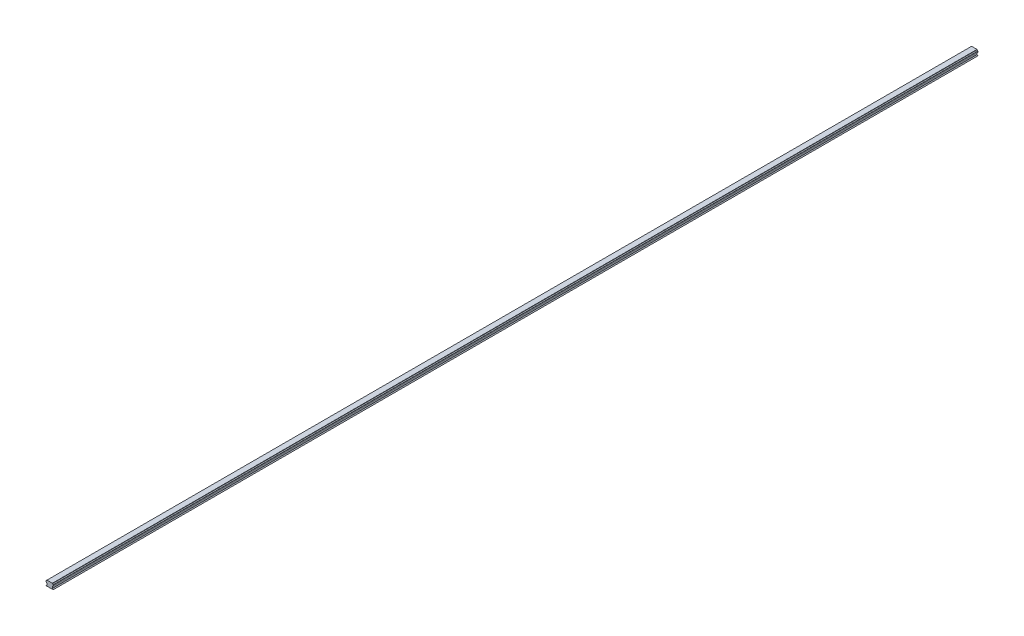
ISO-10303-21;
HEADER;
FILE_DESCRIPTION(('STEP AP214'),'2;1');
FILE_NAME('part.step','',(''),(''),'','','');
FILE_SCHEMA(('AUTOMOTIVE_DESIGN { 1 0 10303 214 1 1 1 1 }'));
ENDSEC;
DATA;
#1=APPLICATION_CONTEXT('core data for automotive mechanical design processes');
#2=APPLICATION_PROTOCOL_DEFINITION('international standard','automotive_design',2000,#1);
#3=PRODUCT_CONTEXT('',#1,'mechanical');
#4=PRODUCT('Part','Part','',(#3));
#5=PRODUCT_RELATED_PRODUCT_CATEGORY('part','',(#4));
#6=PRODUCT_DEFINITION_FORMATION('','',#4);
#7=PRODUCT_DEFINITION_CONTEXT('part definition',#1,'design');
#8=PRODUCT_DEFINITION('design','',#6,#7);
#9=PRODUCT_DEFINITION_SHAPE('','',#8);
#10=(LENGTH_UNIT() NAMED_UNIT(*) SI_UNIT(.MILLI.,.METRE.));
#11=(NAMED_UNIT(*) PLANE_ANGLE_UNIT() SI_UNIT($,.RADIAN.));
#12=(NAMED_UNIT(*) SI_UNIT($,.STERADIAN.) SOLID_ANGLE_UNIT());
#13=UNCERTAINTY_MEASURE_WITH_UNIT(LENGTH_MEASURE(1.E-05),#10,'distance_accuracy_value','');
#14=(GEOMETRIC_REPRESENTATION_CONTEXT(3) GLOBAL_UNCERTAINTY_ASSIGNED_CONTEXT((#13)) GLOBAL_UNIT_ASSIGNED_CONTEXT((#10,
#11,#12)) REPRESENTATION_CONTEXT('',''));
#15=CARTESIAN_POINT('',(0.,0.,0.));
#16=DIRECTION('',(0.,0.,1.));
#17=DIRECTION('',(1.,0.,0.));
#18=AXIS2_PLACEMENT_3D('',#15,#16,#17);
#19=CARTESIAN_POINT('',(12.4987883979856,-8.46322794005069,2900.));
#20=DIRECTION('',(0.,0.,-1.));
#21=DIRECTION('',(-1.,0.,0.));
#22=AXIS2_PLACEMENT_3D('',#19,#20,#21);
#23=CYLINDRICAL_SURFACE('',#22,2.5);
#24=CARTESIAN_POINT('',(12.4987883979856,-8.46322794005069,0.));
#25=DIRECTION('',(0.,0.,1.));
#26=DIRECTION('',(1.,0.,0.));
#27=AXIS2_PLACEMENT_3D('',#24,#25,#26);
#28=CIRCLE('',#27,2.5);
#29=CARTESIAN_POINT('',(12.3041980430387,-5.97081252648865,0.));
#30=VERTEX_POINT('',#29);
#31=CARTESIAN_POINT('',(10.0063729844235,-8.26863758510385,0.));
#32=VERTEX_POINT('',#31);
#33=EDGE_CURVE('E200',#30,#32,#28,.T.);
#34=ORIENTED_EDGE('',*,*,#33,.F.);
#35=DIRECTION('',(0.,0.,-1.));
#36=VECTOR('',#35,1.);
#37=CARTESIAN_POINT('',(12.3041980430387,-5.97081252648865,2900.));
#38=LINE('',#37,#36);
#39=CARTESIAN_POINT('',(12.3041980430387,-5.97081252648865,2900.));
#40=VERTEX_POINT('',#39);
#41=EDGE_CURVE('E11',#40,#30,#38,.T.);
#42=ORIENTED_EDGE('',*,*,#41,.F.);
#43=CARTESIAN_POINT('',(12.4987883979856,-8.46322794005069,2900.));
#44=DIRECTION('',(0.,0.,1.));
#45=DIRECTION('',(1.,0.,0.));
#46=AXIS2_PLACEMENT_3D('',#43,#44,#45);
#47=CIRCLE('',#46,2.5);
#48=CARTESIAN_POINT('',(10.0063729844235,-8.26863758510385,2900.));
#49=VERTEX_POINT('',#48);
#50=EDGE_CURVE('E256',#40,#49,#47,.T.);
#51=ORIENTED_EDGE('',*,*,#50,.T.);
#52=DIRECTION('',(0.,0.,-1.));
#53=VECTOR('',#52,1.);
#54=CARTESIAN_POINT('',(10.0063729844235,-8.26863758510385,2900.));
#55=LINE('',#54,#53);
#56=EDGE_CURVE('E51',#49,#32,#55,.T.);
#57=ORIENTED_EDGE('',*,*,#56,.T.);
#58=EDGE_LOOP('',(#34,#42,#51,#57));
#59=FACE_BOUND('',#58,.T.);
#60=ADVANCED_FACE('F35',(#59),#23,.F.);
#61=CARTESIAN_POINT('',(9.13750528476369,-9.13750528476369,2900.));
#62=DIRECTION('',(0.707106781186548,-0.707106781186548,0.));
#63=DIRECTION('',(0.707106781186548,0.707106781186548,0.));
#64=AXIS2_PLACEMENT_3D('',#61,#62,#63);
#65=PLANE('',#64);
#66=DIRECTION('',(-0.707106781186548,-0.707106781186548,0.));
#67=VECTOR('',#66,1.);
#68=CARTESIAN_POINT('',(9.13750528476369,-9.13750528476369,0.));
#69=LINE('',#68,#67);
#70=CARTESIAN_POINT('',(12.4987883979856,-5.77622217154175,0.));
#71=VERTEX_POINT('',#70);
#72=EDGE_CURVE('E202',#71,#30,#69,.T.);
#73=ORIENTED_EDGE('',*,*,#72,.F.);
#74=DIRECTION('',(0.,0.,-1.));
#75=VECTOR('',#74,1.);
#76=CARTESIAN_POINT('',(12.4987883979856,-5.77622217154175,2900.));
#77=LINE('',#76,#75);
#78=CARTESIAN_POINT('',(12.4987883979856,-5.77622217154175,2900.));
#79=VERTEX_POINT('',#78);
#80=EDGE_CURVE('E43',#79,#71,#77,.T.);
#81=ORIENTED_EDGE('',*,*,#80,.F.);
#82=DIRECTION('',(-0.707106781186548,-0.707106781186548,0.));
#83=VECTOR('',#82,1.);
#84=CARTESIAN_POINT('',(9.13750528476369,-9.13750528476369,2900.));
#85=LINE('',#84,#83);
#86=EDGE_CURVE('E309',#79,#40,#85,.T.);
#87=ORIENTED_EDGE('',*,*,#86,.T.);
#88=ORIENTED_EDGE('',*,*,#41,.T.);
#89=EDGE_LOOP('',(#73,#81,#87,#88));
#90=FACE_BOUND('',#89,.T.);
#91=ADVANCED_FACE('F297',(#90),#65,.T.);
#92=CARTESIAN_POINT('',(12.4987883979856,0.,2900.));
#93=DIRECTION('',(1.,0.,0.));
#94=DIRECTION('',(0.,0.,-1.));
#95=AXIS2_PLACEMENT_3D('',#92,#93,#94);
#96=PLANE('',#95);
#97=DIRECTION('',(0.,-1.,0.));
#98=VECTOR('',#97,1.);
#99=CARTESIAN_POINT('',(12.4987883979856,0.,0.));
#100=LINE('',#99,#98);
#101=CARTESIAN_POINT('',(12.4987883979856,-2.77622217154181,0.));
#102=VERTEX_POINT('',#101);
#103=EDGE_CURVE('E205',#102,#71,#100,.T.);
#104=ORIENTED_EDGE('',*,*,#103,.F.);
#105=DIRECTION('',(0.,0.,-1.));
#106=VECTOR('',#105,1.);
#107=CARTESIAN_POINT('',(12.4987883979856,-2.77622217154181,2900.));
#108=LINE('',#107,#106);
#109=CARTESIAN_POINT('',(12.4987883979856,-2.77622217154181,2900.));
#110=VERTEX_POINT('',#109);
#111=EDGE_CURVE('E286',#110,#102,#108,.T.);
#112=ORIENTED_EDGE('',*,*,#111,.F.);
#113=DIRECTION('',(0.,-1.,0.));
#114=VECTOR('',#113,1.);
#115=CARTESIAN_POINT('',(12.4987883979856,0.,2900.));
#116=LINE('',#115,#114);
#117=EDGE_CURVE('E293',#110,#79,#116,.T.);
#118=ORIENTED_EDGE('',*,*,#117,.T.);
#119=ORIENTED_EDGE('',*,*,#80,.T.);
#120=EDGE_LOOP('',(#104,#112,#118,#119));
#121=FACE_BOUND('',#120,.T.);
#122=ADVANCED_FACE('F291',(#121),#96,.T.);
#123=CARTESIAN_POINT('',(4.86128311322192,4.86128311322192,2900.));
#124=DIRECTION('',(0.707106781186548,0.707106781186548,0.));
#125=DIRECTION('',(-0.707106781186548,0.707106781186548,0.));
#126=AXIS2_PLACEMENT_3D('',#123,#124,#125);
#127=PLANE('',#126);
#128=DIRECTION('',(0.707106781186548,-0.707106781186548,0.));
#129=VECTOR('',#128,1.);
#130=CARTESIAN_POINT('',(4.86128311322192,4.86128311322192,0.));
#131=LINE('',#130,#129);
#132=CARTESIAN_POINT('',(12.3041980430388,-2.58163181659496,0.));
#133=VERTEX_POINT('',#132);
#134=EDGE_CURVE('E208',#133,#102,#131,.T.);
#135=ORIENTED_EDGE('',*,*,#134,.F.);
#136=DIRECTION('',(0.,0.,-1.));
#137=VECTOR('',#136,1.);
#138=CARTESIAN_POINT('',(12.3041980430388,-2.58163181659496,2900.));
#139=LINE('',#138,#137);
#140=CARTESIAN_POINT('',(12.3041980430388,-2.58163181659496,2900.));
#141=VERTEX_POINT('',#140);
#142=EDGE_CURVE('E284',#141,#133,#139,.T.);
#143=ORIENTED_EDGE('',*,*,#142,.F.);
#144=DIRECTION('',(0.707106781186548,-0.707106781186548,0.));
#145=VECTOR('',#144,1.);
#146=CARTESIAN_POINT('',(4.86128311322192,4.86128311322192,2900.));
#147=LINE('',#146,#145);
#148=EDGE_CURVE('E306',#141,#110,#147,.T.);
#149=ORIENTED_EDGE('',*,*,#148,.T.);
#150=ORIENTED_EDGE('',*,*,#111,.T.);
#151=EDGE_LOOP('',(#135,#143,#149,#150));
#152=FACE_BOUND('',#151,.T.);
#153=ADVANCED_FACE('F303',(#152),#127,.T.);
#154=CARTESIAN_POINT('',(12.4987883979856,-0.0892164030329295,2900.));
#155=DIRECTION('',(0.,0.,-1.));
#156=DIRECTION('',(-1.,0.,0.));
#157=AXIS2_PLACEMENT_3D('',#154,#155,#156);
#158=CYLINDRICAL_SURFACE('',#157,2.49999999999998);
#159=CARTESIAN_POINT('',(12.4987883979856,-0.0892164030329295,0.));
#160=DIRECTION('',(0.,0.,1.));
#161=DIRECTION('',(1.,0.,0.));
#162=AXIS2_PLACEMENT_3D('',#159,#160,#161);
#163=CIRCLE('',#162,2.49999999999998);
#164=CARTESIAN_POINT('',(10.0063729844236,-0.283806757979913,0.));
#165=VERTEX_POINT('',#164);
#166=EDGE_CURVE('E211',#165,#133,#163,.T.);
#167=ORIENTED_EDGE('',*,*,#166,.F.);
#168=DIRECTION('',(0.,0.,-1.));
#169=VECTOR('',#168,1.);
#170=CARTESIAN_POINT('',(10.0063729844236,-0.283806757979913,2900.));
#171=LINE('',#170,#169);
#172=CARTESIAN_POINT('',(10.0063729844236,-0.283806757979913,2900.));
#173=VERTEX_POINT('',#172);
#174=EDGE_CURVE('E282',#173,#165,#171,.T.);
#175=ORIENTED_EDGE('',*,*,#174,.F.);
#176=CARTESIAN_POINT('',(12.4987883979856,-0.0892164030329295,2900.));
#177=DIRECTION('',(0.,0.,1.));
#178=DIRECTION('',(1.,0.,0.));
#179=AXIS2_PLACEMENT_3D('',#176,#177,#178);
#180=CIRCLE('',#179,2.49999999999998);
#181=EDGE_CURVE('E311',#173,#141,#180,.T.);
#182=ORIENTED_EDGE('',*,*,#181,.T.);
#183=ORIENTED_EDGE('',*,*,#142,.T.);
#184=EDGE_LOOP('',(#167,#175,#182,#183));
#185=FACE_BOUND('',#184,.T.);
#186=ADVANCED_FACE('F515',(#185),#158,.F.);
#187=CARTESIAN_POINT('',(4.86128311322186,4.86128311322186,2900.));
#188=DIRECTION('',(0.707106781186548,0.707106781186548,0.));
#189=DIRECTION('',(-0.707106781186548,0.707106781186548,0.));
#190=AXIS2_PLACEMENT_3D('',#187,#188,#189);
#191=PLANE('',#190);
#192=DIRECTION('',(0.707106781186548,-0.707106781186548,0.));
#193=VECTOR('',#192,1.);
#194=CARTESIAN_POINT('',(4.86128311322186,4.86128311322186,0.));
#195=LINE('',#194,#193);
#196=CARTESIAN_POINT('',(9.49878839798586,0.223777828457852,0.));
#197=VERTEX_POINT('',#196);
#198=EDGE_CURVE('E214',#197,#165,#195,.T.);
#199=ORIENTED_EDGE('',*,*,#198,.F.);
#200=DIRECTION('',(0.,0.,-1.));
#201=VECTOR('',#200,1.);
#202=CARTESIAN_POINT('',(9.49878839798586,0.223777828457852,2900.));
#203=LINE('',#202,#201);
#204=CARTESIAN_POINT('',(9.49878839798586,0.223777828457852,2900.));
#205=VERTEX_POINT('',#204);
#206=EDGE_CURVE('E280',#205,#197,#203,.T.);
#207=ORIENTED_EDGE('',*,*,#206,.F.);
#208=DIRECTION('',(0.707106781186548,-0.707106781186548,0.));
#209=VECTOR('',#208,1.);
#210=CARTESIAN_POINT('',(4.86128311322186,4.86128311322186,2900.));
#211=LINE('',#210,#209);
#212=EDGE_CURVE('E317',#205,#173,#211,.T.);
#213=ORIENTED_EDGE('',*,*,#212,.T.);
#214=ORIENTED_EDGE('',*,*,#174,.T.);
#215=EDGE_LOOP('',(#199,#207,#213,#214));
#216=FACE_BOUND('',#215,.T.);
#217=ADVANCED_FACE('F505',(#216),#191,.T.);
#218=CARTESIAN_POINT('',(0.,0.223777828457852,2900.));
#219=DIRECTION('',(0.,1.,0.));
#220=DIRECTION('',(0.,0.,1.));
#221=AXIS2_PLACEMENT_3D('',#218,#219,#220);
#222=PLANE('',#221);
#223=DIRECTION('',(1.,0.,0.));
#224=VECTOR('',#223,1.);
#225=CARTESIAN_POINT('',(0.,0.223777828457852,0.));
#226=LINE('',#225,#224);
#227=CARTESIAN_POINT('',(-7.50121160201477,0.223777828457853,0.));
#228=VERTEX_POINT('',#227);
#229=EDGE_CURVE('E217',#228,#197,#226,.T.);
#230=ORIENTED_EDGE('',*,*,#229,.F.);
#231=DIRECTION('',(0.,0.,-1.));
#232=VECTOR('',#231,1.);
#233=CARTESIAN_POINT('',(-7.50121160201477,0.223777828457853,2900.));
#234=LINE('',#233,#232);
#235=CARTESIAN_POINT('',(-7.50121160201477,0.223777828457853,2900.));
#236=VERTEX_POINT('',#235);
#237=EDGE_CURVE('E278',#236,#228,#234,.T.);
#238=ORIENTED_EDGE('',*,*,#237,.F.);
#239=DIRECTION('',(1.,0.,0.));
#240=VECTOR('',#239,1.);
#241=CARTESIAN_POINT('',(0.,0.223777828457852,2900.));
#242=LINE('',#241,#240);
#243=EDGE_CURVE('E320',#236,#205,#242,.T.);
#244=ORIENTED_EDGE('',*,*,#243,.T.);
#245=ORIENTED_EDGE('',*,*,#206,.T.);
#246=EDGE_LOOP('',(#230,#238,#244,#245));
#247=FACE_BOUND('',#246,.T.);
#248=ADVANCED_FACE('F495',(#247),#222,.T.);
#249=CARTESIAN_POINT('',(-3.86249471523632,3.86249471523631,2900.));
#250=DIRECTION('',(-0.707106781186549,0.707106781186546,0.));
#251=DIRECTION('',(-0.707106781186546,-0.707106781186549,0.));
#252=AXIS2_PLACEMENT_3D('',#249,#250,#251);
#253=PLANE('',#252);
#254=DIRECTION('',(0.707106781186546,0.707106781186549,0.));
#255=VECTOR('',#254,1.);
#256=CARTESIAN_POINT('',(-3.86249471523632,3.86249471523631,0.));
#257=LINE('',#256,#255);
#258=CARTESIAN_POINT('',(-8.0087961884529,-0.283806757980286,0.));
#259=VERTEX_POINT('',#258);
#260=EDGE_CURVE('E220',#259,#228,#257,.T.);
#261=ORIENTED_EDGE('',*,*,#260,.F.);
#262=DIRECTION('',(0.,0.,-1.));
#263=VECTOR('',#262,1.);
#264=CARTESIAN_POINT('',(-8.0087961884529,-0.283806757980286,2900.));
#265=LINE('',#264,#263);
#266=CARTESIAN_POINT('',(-8.0087961884529,-0.283806757980286,2900.));
#267=VERTEX_POINT('',#266);
#268=EDGE_CURVE('E276',#267,#259,#265,.T.);
#269=ORIENTED_EDGE('',*,*,#268,.F.);
#270=DIRECTION('',(0.707106781186546,0.707106781186549,0.));
#271=VECTOR('',#270,1.);
#272=CARTESIAN_POINT('',(-3.86249471523632,3.86249471523631,2900.));
#273=LINE('',#272,#271);
#274=EDGE_CURVE('E323',#267,#236,#273,.T.);
#275=ORIENTED_EDGE('',*,*,#274,.T.);
#276=ORIENTED_EDGE('',*,*,#237,.T.);
#277=EDGE_LOOP('',(#261,#269,#275,#276));
#278=FACE_BOUND('',#277,.T.);
#279=ADVANCED_FACE('F485',(#278),#253,.T.);
#280=CARTESIAN_POINT('',(-10.5012116020148,-0.0892164030332557,2900.));
#281=DIRECTION('',(0.,0.,-1.));
#282=DIRECTION('',(-1.,0.,0.));
#283=AXIS2_PLACEMENT_3D('',#280,#281,#282);
#284=CYLINDRICAL_SURFACE('',#283,2.49999999999983);
#285=CARTESIAN_POINT('',(-10.5012116020148,-0.0892164030332557,0.));
#286=DIRECTION('',(0.,0.,1.));
#287=DIRECTION('',(1.,0.,0.));
#288=AXIS2_PLACEMENT_3D('',#285,#286,#287);
#289=CIRCLE('',#288,2.49999999999983);
#290=CARTESIAN_POINT('',(-10.3066212470681,-2.58163181659515,0.));
#291=VERTEX_POINT('',#290);
#292=EDGE_CURVE('E223',#291,#259,#289,.T.);
#293=ORIENTED_EDGE('',*,*,#292,.F.);
#294=DIRECTION('',(0.,0.,-1.));
#295=VECTOR('',#294,1.);
#296=CARTESIAN_POINT('',(-10.3066212470681,-2.58163181659515,2900.));
#297=LINE('',#296,#295);
#298=CARTESIAN_POINT('',(-10.3066212470681,-2.58163181659515,2900.));
#299=VERTEX_POINT('',#298);
#300=EDGE_CURVE('E274',#299,#291,#297,.T.);
#301=ORIENTED_EDGE('',*,*,#300,.F.);
#302=CARTESIAN_POINT('',(-10.5012116020148,-0.0892164030332557,2900.));
#303=DIRECTION('',(0.,0.,1.));
#304=DIRECTION('',(1.,0.,0.));
#305=AXIS2_PLACEMENT_3D('',#302,#303,#304);
#306=CIRCLE('',#305,2.49999999999983);
#307=EDGE_CURVE('E326',#299,#267,#306,.T.);
#308=ORIENTED_EDGE('',*,*,#307,.T.);
#309=ORIENTED_EDGE('',*,*,#268,.T.);
#310=EDGE_LOOP('',(#293,#301,#308,#309));
#311=FACE_BOUND('',#310,.T.);
#312=ADVANCED_FACE('F475',(#311),#284,.F.);
#313=CARTESIAN_POINT('',(-3.86249471523647,3.86249471523647,2900.));
#314=DIRECTION('',(-0.707106781186548,0.707106781186548,0.));
#315=DIRECTION('',(-0.707106781186548,-0.707106781186548,0.));
#316=AXIS2_PLACEMENT_3D('',#313,#314,#315);
#317=PLANE('',#316);
#318=DIRECTION('',(0.707106781186548,0.707106781186548,0.));
#319=VECTOR('',#318,1.);
#320=CARTESIAN_POINT('',(-3.86249471523647,3.86249471523647,0.));
#321=LINE('',#320,#319);
#322=CARTESIAN_POINT('',(-10.5012116020148,-2.77622217154183,0.));
#323=VERTEX_POINT('',#322);
#324=EDGE_CURVE('E226',#323,#291,#321,.T.);
#325=ORIENTED_EDGE('',*,*,#324,.F.);
#326=DIRECTION('',(0.,0.,-1.));
#327=VECTOR('',#326,1.);
#328=CARTESIAN_POINT('',(-10.5012116020148,-2.77622217154183,2900.));
#329=LINE('',#328,#327);
#330=CARTESIAN_POINT('',(-10.5012116020148,-2.77622217154183,2900.));
#331=VERTEX_POINT('',#330);
#332=EDGE_CURVE('E272',#331,#323,#329,.T.);
#333=ORIENTED_EDGE('',*,*,#332,.F.);
#334=DIRECTION('',(0.707106781186548,0.707106781186548,0.));
#335=VECTOR('',#334,1.);
#336=CARTESIAN_POINT('',(-3.86249471523647,3.86249471523647,2900.));
#337=LINE('',#336,#335);
#338=EDGE_CURVE('E329',#331,#299,#337,.T.);
#339=ORIENTED_EDGE('',*,*,#338,.T.);
#340=ORIENTED_EDGE('',*,*,#300,.T.);
#341=EDGE_LOOP('',(#325,#333,#339,#340));
#342=FACE_BOUND('',#341,.T.);
#343=ADVANCED_FACE('F465',(#342),#317,.T.);
#344=CARTESIAN_POINT('',(-10.5012116020148,0.,2900.));
#345=DIRECTION('',(-1.,0.,0.));
#346=DIRECTION('',(0.,0.,1.));
#347=AXIS2_PLACEMENT_3D('',#344,#345,#346);
#348=PLANE('',#347);
#349=DIRECTION('',(0.,1.,0.));
#350=VECTOR('',#349,1.);
#351=CARTESIAN_POINT('',(-10.5012116020148,0.,0.));
#352=LINE('',#351,#350);
#353=CARTESIAN_POINT('',(-10.5012116020148,-5.77622217154183,0.));
#354=VERTEX_POINT('',#353);
#355=EDGE_CURVE('E229',#354,#323,#352,.T.);
#356=ORIENTED_EDGE('',*,*,#355,.F.);
#357=DIRECTION('',(0.,0.,-1.));
#358=VECTOR('',#357,1.);
#359=CARTESIAN_POINT('',(-10.5012116020148,-5.77622217154183,2900.));
#360=LINE('',#359,#358);
#361=CARTESIAN_POINT('',(-10.5012116020148,-5.77622217154183,2900.));
#362=VERTEX_POINT('',#361);
#363=EDGE_CURVE('E270',#362,#354,#360,.T.);
#364=ORIENTED_EDGE('',*,*,#363,.F.);
#365=DIRECTION('',(0.,1.,0.));
#366=VECTOR('',#365,1.);
#367=CARTESIAN_POINT('',(-10.5012116020148,0.,2900.));
#368=LINE('',#367,#366);
#369=EDGE_CURVE('E332',#362,#331,#368,.T.);
#370=ORIENTED_EDGE('',*,*,#369,.T.);
#371=ORIENTED_EDGE('',*,*,#332,.T.);
#372=EDGE_LOOP('',(#356,#364,#370,#371));
#373=FACE_BOUND('',#372,.T.);
#374=ADVANCED_FACE('F455',(#373),#348,.T.);
#375=CARTESIAN_POINT('',(-8.1387168867783,-8.1387168867783,2900.));
#376=DIRECTION('',(-0.707106781186548,-0.707106781186548,0.));
#377=DIRECTION('',(0.707106781186548,-0.707106781186548,0.));
#378=AXIS2_PLACEMENT_3D('',#375,#376,#377);
#379=PLANE('',#378);
#380=DIRECTION('',(-0.707106781186548,0.707106781186548,0.));
#381=VECTOR('',#380,1.);
#382=CARTESIAN_POINT('',(-8.1387168867783,-8.1387168867783,0.));
#383=LINE('',#382,#381);
#384=CARTESIAN_POINT('',(-10.3066212470679,-5.97081252648868,0.));
#385=VERTEX_POINT('',#384);
#386=EDGE_CURVE('E232',#385,#354,#383,.T.);
#387=ORIENTED_EDGE('',*,*,#386,.F.);
#388=DIRECTION('',(0.,0.,-1.));
#389=VECTOR('',#388,1.);
#390=CARTESIAN_POINT('',(-10.3066212470679,-5.97081252648868,2900.));
#391=LINE('',#390,#389);
#392=CARTESIAN_POINT('',(-10.3066212470679,-5.97081252648868,2900.));
#393=VERTEX_POINT('',#392);
#394=EDGE_CURVE('E268',#393,#385,#391,.T.);
#395=ORIENTED_EDGE('',*,*,#394,.F.);
#396=DIRECTION('',(-0.707106781186548,0.707106781186548,0.));
#397=VECTOR('',#396,1.);
#398=CARTESIAN_POINT('',(-8.1387168867783,-8.1387168867783,2900.));
#399=LINE('',#398,#397);
#400=EDGE_CURVE('E335',#393,#362,#399,.T.);
#401=ORIENTED_EDGE('',*,*,#400,.T.);
#402=ORIENTED_EDGE('',*,*,#363,.T.);
#403=EDGE_LOOP('',(#387,#395,#401,#402));
#404=FACE_BOUND('',#403,.T.);
#405=ADVANCED_FACE('F445',(#404),#379,.T.);
#406=CARTESIAN_POINT('',(-10.5012116020148,-8.46322794005072,2900.));
#407=DIRECTION('',(0.,0.,-1.));
#408=DIRECTION('',(-1.,0.,0.));
#409=AXIS2_PLACEMENT_3D('',#406,#407,#408);
#410=CYLINDRICAL_SURFACE('',#409,2.5);
#411=CARTESIAN_POINT('',(-10.5012116020148,-8.46322794005072,0.));
#412=DIRECTION('',(0.,0.,1.));
#413=DIRECTION('',(1.,0.,0.));
#414=AXIS2_PLACEMENT_3D('',#411,#412,#413);
#415=CIRCLE('',#414,2.5);
#416=CARTESIAN_POINT('',(-8.00879618845272,-8.26863758510388,0.));
#417=VERTEX_POINT('',#416);
#418=EDGE_CURVE('E235',#417,#385,#415,.T.);
#419=ORIENTED_EDGE('',*,*,#418,.F.);
#420=DIRECTION('',(0.,0.,-1.));
#421=VECTOR('',#420,1.);
#422=CARTESIAN_POINT('',(-8.00879618845272,-8.26863758510388,2900.));
#423=LINE('',#422,#421);
#424=CARTESIAN_POINT('',(-8.00879618845272,-8.26863758510388,2900.));
#425=VERTEX_POINT('',#424);
#426=EDGE_CURVE('E266',#425,#417,#423,.T.);
#427=ORIENTED_EDGE('',*,*,#426,.F.);
#428=CARTESIAN_POINT('',(-10.5012116020148,-8.46322794005072,2900.));
#429=DIRECTION('',(0.,0.,1.));
#430=DIRECTION('',(1.,0.,0.));
#431=AXIS2_PLACEMENT_3D('',#428,#429,#430);
#432=CIRCLE('',#431,2.5);
#433=EDGE_CURVE('E338',#425,#393,#432,.T.);
#434=ORIENTED_EDGE('',*,*,#433,.T.);
#435=ORIENTED_EDGE('',*,*,#394,.T.);
#436=EDGE_LOOP('',(#419,#427,#434,#435));
#437=FACE_BOUND('',#436,.T.);
#438=ADVANCED_FACE('F435',(#437),#410,.F.);
#439=CARTESIAN_POINT('',(-8.1387168867783,-8.1387168867783,2900.));
#440=DIRECTION('',(-0.707106781186548,-0.707106781186548,0.));
#441=DIRECTION('',(0.707106781186548,-0.707106781186548,0.));
#442=AXIS2_PLACEMENT_3D('',#439,#440,#441);
#443=PLANE('',#442);
#444=DIRECTION('',(-0.707106781186548,0.707106781186548,0.));
#445=VECTOR('',#444,1.);
#446=CARTESIAN_POINT('',(-8.1387168867783,-8.1387168867783,0.));
#447=LINE('',#446,#445);
#448=CARTESIAN_POINT('',(-7.50121160201465,-8.77622217154195,0.));
#449=VERTEX_POINT('',#448);
#450=EDGE_CURVE('E238',#449,#417,#447,.T.);
#451=ORIENTED_EDGE('',*,*,#450,.F.);
#452=DIRECTION('',(0.,0.,-1.));
#453=VECTOR('',#452,1.);
#454=CARTESIAN_POINT('',(-7.50121160201465,-8.77622217154195,2900.));
#455=LINE('',#454,#453);
#456=CARTESIAN_POINT('',(-7.50121160201465,-8.77622217154195,2900.));
#457=VERTEX_POINT('',#456);
#458=EDGE_CURVE('E264',#457,#449,#455,.T.);
#459=ORIENTED_EDGE('',*,*,#458,.F.);
#460=DIRECTION('',(-0.707106781186548,0.707106781186548,0.));
#461=VECTOR('',#460,1.);
#462=CARTESIAN_POINT('',(-8.1387168867783,-8.1387168867783,2900.));
#463=LINE('',#462,#461);
#464=EDGE_CURVE('E341',#457,#425,#463,.T.);
#465=ORIENTED_EDGE('',*,*,#464,.T.);
#466=ORIENTED_EDGE('',*,*,#426,.T.);
#467=EDGE_LOOP('',(#451,#459,#465,#466));
#468=FACE_BOUND('',#467,.T.);
#469=ADVANCED_FACE('F426',(#468),#443,.T.);
#470=CARTESIAN_POINT('',(-7.50121160201465,0.,2900.));
#471=DIRECTION('',(-1.,0.,0.));
#472=DIRECTION('',(0.,0.,1.));
#473=AXIS2_PLACEMENT_3D('',#470,#471,#472);
#474=PLANE('',#473);
#475=DIRECTION('',(0.,1.,0.));
#476=VECTOR('',#475,1.);
#477=CARTESIAN_POINT('',(-7.50121160201465,0.,0.));
#478=LINE('',#477,#476);
#479=CARTESIAN_POINT('',(-7.50121160201465,-13.7762221715419,0.));
#480=VERTEX_POINT('',#479);
#481=EDGE_CURVE('E241',#480,#449,#478,.T.);
#482=ORIENTED_EDGE('',*,*,#481,.F.);
#483=DIRECTION('',(0.,0.,-1.));
#484=VECTOR('',#483,1.);
#485=CARTESIAN_POINT('',(-7.50121160201465,-13.7762221715419,2900.));
#486=LINE('',#485,#484);
#487=CARTESIAN_POINT('',(-7.50121160201465,-13.7762221715419,2900.));
#488=VERTEX_POINT('',#487);
#489=EDGE_CURVE('E262',#488,#480,#486,.T.);
#490=ORIENTED_EDGE('',*,*,#489,.F.);
#491=DIRECTION('',(0.,1.,0.));
#492=VECTOR('',#491,1.);
#493=CARTESIAN_POINT('',(-7.50121160201465,0.,2900.));
#494=LINE('',#493,#492);
#495=EDGE_CURVE('E344',#488,#457,#494,.T.);
#496=ORIENTED_EDGE('',*,*,#495,.T.);
#497=ORIENTED_EDGE('',*,*,#458,.T.);
#498=EDGE_LOOP('',(#482,#490,#496,#497));
#499=FACE_BOUND('',#498,.T.);
#500=ADVANCED_FACE('F357',(#499),#474,.T.);
#501=CARTESIAN_POINT('',(3.13750528476362,-3.13750528476363,2900.));
#502=DIRECTION('',(-0.707106781186547,0.707106781186548,0.));
#503=DIRECTION('',(-0.707106781186548,-0.707106781186547,0.));
#504=AXIS2_PLACEMENT_3D('',#501,#502,#503);
#505=PLANE('',#504);
#506=DIRECTION('',(0.707106781186548,0.707106781186547,0.));
#507=VECTOR('',#506,1.);
#508=CARTESIAN_POINT('',(3.13750528476362,-3.13750528476363,0.));
#509=LINE('',#508,#507);
#510=CARTESIAN_POINT('',(-10.0012116020146,-16.2762221715419,0.));
#511=VERTEX_POINT('',#510);
#512=EDGE_CURVE('E244',#511,#480,#509,.T.);
#513=ORIENTED_EDGE('',*,*,#512,.F.);
#514=DIRECTION('',(0.,0.,-1.));
#515=VECTOR('',#514,1.);
#516=CARTESIAN_POINT('',(-10.0012116020146,-16.2762221715419,2900.));
#517=LINE('',#516,#515);
#518=CARTESIAN_POINT('',(-10.0012116020146,-16.2762221715419,2900.));
#519=VERTEX_POINT('',#518);
#520=EDGE_CURVE('E260',#519,#511,#517,.T.);
#521=ORIENTED_EDGE('',*,*,#520,.F.);
#522=DIRECTION('',(0.707106781186548,0.707106781186547,0.));
#523=VECTOR('',#522,1.);
#524=CARTESIAN_POINT('',(3.13750528476362,-3.13750528476363,2900.));
#525=LINE('',#524,#523);
#526=EDGE_CURVE('E347',#519,#488,#525,.T.);
#527=ORIENTED_EDGE('',*,*,#526,.T.);
#528=ORIENTED_EDGE('',*,*,#489,.T.);
#529=EDGE_LOOP('',(#513,#521,#527,#528));
#530=FACE_BOUND('',#529,.T.);
#531=ADVANCED_FACE('F351',(#530),#505,.T.);
#532=CARTESIAN_POINT('',(0.,-16.2762221715418,2900.));
#533=DIRECTION('',(0.,1.,0.));
#534=DIRECTION('',(-1.,0.,0.));
#535=AXIS2_PLACEMENT_3D('',#532,#533,#534);
#536=PLANE('',#535);
#537=DIRECTION('',(1.,0.,0.));
#538=VECTOR('',#537,1.);
#539=CARTESIAN_POINT('',(0.,-16.2762221715418,0.));
#540=LINE('',#539,#538);
#541=CARTESIAN_POINT('',(11.9987883979856,-16.2762221715418,0.));
#542=VERTEX_POINT('',#541);
#543=EDGE_CURVE('E247',#511,#542,#540,.T.);
#544=ORIENTED_EDGE('',*,*,#543,.T.);
#545=DIRECTION('',(0.,0.,-1.));
#546=VECTOR('',#545,1.);
#547=CARTESIAN_POINT('',(11.9987883979856,-16.2762221715418,2900.));
#548=LINE('',#547,#546);
#549=CARTESIAN_POINT('',(11.9987883979856,-16.2762221715418,2900.));
#550=VERTEX_POINT('',#549);
#551=EDGE_CURVE('E182',#550,#542,#548,.T.);
#552=ORIENTED_EDGE('',*,*,#551,.F.);
#553=DIRECTION('',(1.,0.,0.));
#554=VECTOR('',#553,1.);
#555=CARTESIAN_POINT('',(0.,-16.2762221715418,2900.));
#556=LINE('',#555,#554);
#557=EDGE_CURVE('E191',#519,#550,#556,.T.);
#558=ORIENTED_EDGE('',*,*,#557,.F.);
#559=ORIENTED_EDGE('',*,*,#520,.T.);
#560=EDGE_LOOP('',(#544,#552,#558,#559));
#561=FACE_BOUND('',#560,.T.);
#562=ADVANCED_FACE('F361',(#561),#536,.F.);
#563=CARTESIAN_POINT('',(-2.13871688677806,-2.13871688677806,2900.));
#564=DIRECTION('',(0.707106781186548,0.707106781186548,0.));
#565=DIRECTION('',(-0.707106781186548,0.707106781186548,0.));
#566=AXIS2_PLACEMENT_3D('',#563,#564,#565);
#567=PLANE('',#566);
#568=DIRECTION('',(0.707106781186548,-0.707106781186548,0.));
#569=VECTOR('',#568,1.);
#570=CARTESIAN_POINT('',(-2.13871688677806,-2.13871688677806,0.));
#571=LINE('',#570,#569);
#572=CARTESIAN_POINT('',(9.49878839798558,-13.7762221715417,0.));
#573=VERTEX_POINT('',#572);
#574=EDGE_CURVE('E178',#573,#542,#571,.T.);
#575=ORIENTED_EDGE('',*,*,#574,.F.);
#576=DIRECTION('',(0.,0.,-1.));
#577=VECTOR('',#576,1.);
#578=CARTESIAN_POINT('',(9.49878839798558,-13.7762221715417,2900.));
#579=LINE('',#578,#577);
#580=CARTESIAN_POINT('',(9.49878839798558,-13.7762221715417,2900.));
#581=VERTEX_POINT('',#580);
#582=EDGE_CURVE('E173',#581,#573,#579,.T.);
#583=ORIENTED_EDGE('',*,*,#582,.F.);
#584=DIRECTION('',(0.707106781186548,-0.707106781186548,0.));
#585=VECTOR('',#584,1.);
#586=CARTESIAN_POINT('',(-2.13871688677806,-2.13871688677806,2900.));
#587=LINE('',#586,#585);
#588=EDGE_CURVE('E176',#581,#550,#587,.T.);
#589=ORIENTED_EDGE('',*,*,#588,.T.);
#590=ORIENTED_EDGE('',*,*,#551,.T.);
#591=EDGE_LOOP('',(#575,#583,#589,#590));
#592=FACE_BOUND('',#591,.T.);
#593=ADVANCED_FACE('F175',(#592),#567,.T.);
#594=CARTESIAN_POINT('',(9.49878839798558,0.,2900.));
#595=DIRECTION('',(1.,0.,0.));
#596=DIRECTION('',(0.,0.,-1.));
#597=AXIS2_PLACEMENT_3D('',#594,#595,#596);
#598=PLANE('',#597);
#599=DIRECTION('',(0.,-1.,0.));
#600=VECTOR('',#599,1.);
#601=CARTESIAN_POINT('',(9.49878839798558,0.,0.));
#602=LINE('',#601,#600);
#603=CARTESIAN_POINT('',(9.49878839798558,-8.77622217154181,0.));
#604=VERTEX_POINT('',#603);
#605=EDGE_CURVE('E251',#604,#573,#602,.T.);
#606=ORIENTED_EDGE('',*,*,#605,.F.);
#607=DIRECTION('',(0.,0.,-1.));
#608=VECTOR('',#607,1.);
#609=CARTESIAN_POINT('',(9.49878839798558,-8.77622217154181,2900.));
#610=LINE('',#609,#608);
#611=CARTESIAN_POINT('',(9.49878839798558,-8.77622217154181,2900.));
#612=VERTEX_POINT('',#611);
#613=EDGE_CURVE('E112',#612,#604,#610,.T.);
#614=ORIENTED_EDGE('',*,*,#613,.F.);
#615=DIRECTION('',(0.,-1.,0.));
#616=VECTOR('',#615,1.);
#617=CARTESIAN_POINT('',(9.49878839798558,0.,2900.));
#618=LINE('',#617,#616);
#619=EDGE_CURVE('E188',#612,#581,#618,.T.);
#620=ORIENTED_EDGE('',*,*,#619,.T.);
#621=ORIENTED_EDGE('',*,*,#582,.T.);
#622=EDGE_LOOP('',(#606,#614,#620,#621));
#623=FACE_BOUND('',#622,.T.);
#624=ADVANCED_FACE('F194',(#623),#598,.T.);
#625=CARTESIAN_POINT('',(9.13750528476369,-9.13750528476369,2900.));
#626=DIRECTION('',(0.707106781186548,-0.707106781186548,0.));
#627=DIRECTION('',(0.707106781186548,0.707106781186548,0.));
#628=AXIS2_PLACEMENT_3D('',#625,#626,#627);
#629=PLANE('',#628);
#630=DIRECTION('',(-0.707106781186548,-0.707106781186548,0.));
#631=VECTOR('',#630,1.);
#632=CARTESIAN_POINT('',(9.13750528476369,-9.13750528476369,0.));
#633=LINE('',#632,#631);
#634=EDGE_CURVE('E253',#32,#604,#633,.T.);
#635=ORIENTED_EDGE('',*,*,#634,.F.);
#636=ORIENTED_EDGE('',*,*,#56,.F.);
#637=DIRECTION('',(-0.707106781186548,-0.707106781186548,0.));
#638=VECTOR('',#637,1.);
#639=CARTESIAN_POINT('',(9.13750528476369,-9.13750528476369,2900.));
#640=LINE('',#639,#638);
#641=EDGE_CURVE('E195',#49,#612,#640,.T.);
#642=ORIENTED_EDGE('',*,*,#641,.T.);
#643=ORIENTED_EDGE('',*,*,#613,.T.);
#644=EDGE_LOOP('',(#635,#636,#642,#643));
#645=FACE_BOUND('',#644,.T.);
#646=ADVANCED_FACE('F374',(#645),#629,.T.);
#647=CARTESIAN_POINT('',(0.,0.,2900.));
#648=DIRECTION('',(0.,0.,1.));
#649=DIRECTION('',(1.,0.,0.));
#650=AXIS2_PLACEMENT_3D('',#647,#648,#649);
#651=PLANE('',#650);
#652=ORIENTED_EDGE('',*,*,#50,.F.);
#653=ORIENTED_EDGE('',*,*,#86,.F.);
#654=ORIENTED_EDGE('',*,*,#117,.F.);
#655=ORIENTED_EDGE('',*,*,#148,.F.);
#656=ORIENTED_EDGE('',*,*,#181,.F.);
#657=ORIENTED_EDGE('',*,*,#212,.F.);
#658=ORIENTED_EDGE('',*,*,#243,.F.);
#659=ORIENTED_EDGE('',*,*,#274,.F.);
#660=ORIENTED_EDGE('',*,*,#307,.F.);
#661=ORIENTED_EDGE('',*,*,#338,.F.);
#662=ORIENTED_EDGE('',*,*,#369,.F.);
#663=ORIENTED_EDGE('',*,*,#400,.F.);
#664=ORIENTED_EDGE('',*,*,#433,.F.);
#665=ORIENTED_EDGE('',*,*,#464,.F.);
#666=ORIENTED_EDGE('',*,*,#495,.F.);
#667=ORIENTED_EDGE('',*,*,#526,.F.);
#668=ORIENTED_EDGE('',*,*,#557,.T.);
#669=ORIENTED_EDGE('',*,*,#588,.F.);
#670=ORIENTED_EDGE('',*,*,#619,.F.);
#671=ORIENTED_EDGE('',*,*,#641,.F.);
#672=EDGE_LOOP('',(#652,#653,#654,#655,#656,#657,#658,#659,#660,#661,#662,#663,#664,#665,#666,
#667,#668,#669,#670,#671));
#673=FACE_BOUND('',#672,.T.);
#674=ADVANCED_FACE('F186',(#673),#651,.T.);
#675=CARTESIAN_POINT('',(0.,0.,0.));
#676=DIRECTION('',(0.,0.,1.));
#677=DIRECTION('',(1.,0.,0.));
#678=AXIS2_PLACEMENT_3D('',#675,#676,#677);
#679=PLANE('',#678);
#680=ORIENTED_EDGE('',*,*,#33,.T.);
#681=ORIENTED_EDGE('',*,*,#634,.T.);
#682=ORIENTED_EDGE('',*,*,#605,.T.);
#683=ORIENTED_EDGE('',*,*,#574,.T.);
#684=ORIENTED_EDGE('',*,*,#543,.F.);
#685=ORIENTED_EDGE('',*,*,#512,.T.);
#686=ORIENTED_EDGE('',*,*,#481,.T.);
#687=ORIENTED_EDGE('',*,*,#450,.T.);
#688=ORIENTED_EDGE('',*,*,#418,.T.);
#689=ORIENTED_EDGE('',*,*,#386,.T.);
#690=ORIENTED_EDGE('',*,*,#355,.T.);
#691=ORIENTED_EDGE('',*,*,#324,.T.);
#692=ORIENTED_EDGE('',*,*,#292,.T.);
#693=ORIENTED_EDGE('',*,*,#260,.T.);
#694=ORIENTED_EDGE('',*,*,#229,.T.);
#695=ORIENTED_EDGE('',*,*,#198,.T.);
#696=ORIENTED_EDGE('',*,*,#166,.T.);
#697=ORIENTED_EDGE('',*,*,#134,.T.);
#698=ORIENTED_EDGE('',*,*,#103,.T.);
#699=ORIENTED_EDGE('',*,*,#72,.T.);
#700=EDGE_LOOP('',(#680,#681,#682,#683,#684,#685,#686,#687,#688,#689,#690,#691,#692,#693,#694,
#695,#696,#697,#698,#699));
#701=FACE_BOUND('',#700,.T.);
#702=ADVANCED_FACE('F299',(#701),#679,.F.);
#703=CLOSED_SHELL('',(#60,#91,#122,#153,#186,#217,#248,#279,#312,#343,#374,#405,#438,#469,#500,
#531,#562,#593,#624,#646,#674,#702));
#704=MANIFOLD_SOLID_BREP('B2',#703);
#705=ADVANCED_BREP_SHAPE_REPRESENTATION('',(#18,#704),#14);
#706=SHAPE_DEFINITION_REPRESENTATION(#9,#705);
ENDSEC;
END-ISO-10303-21;
